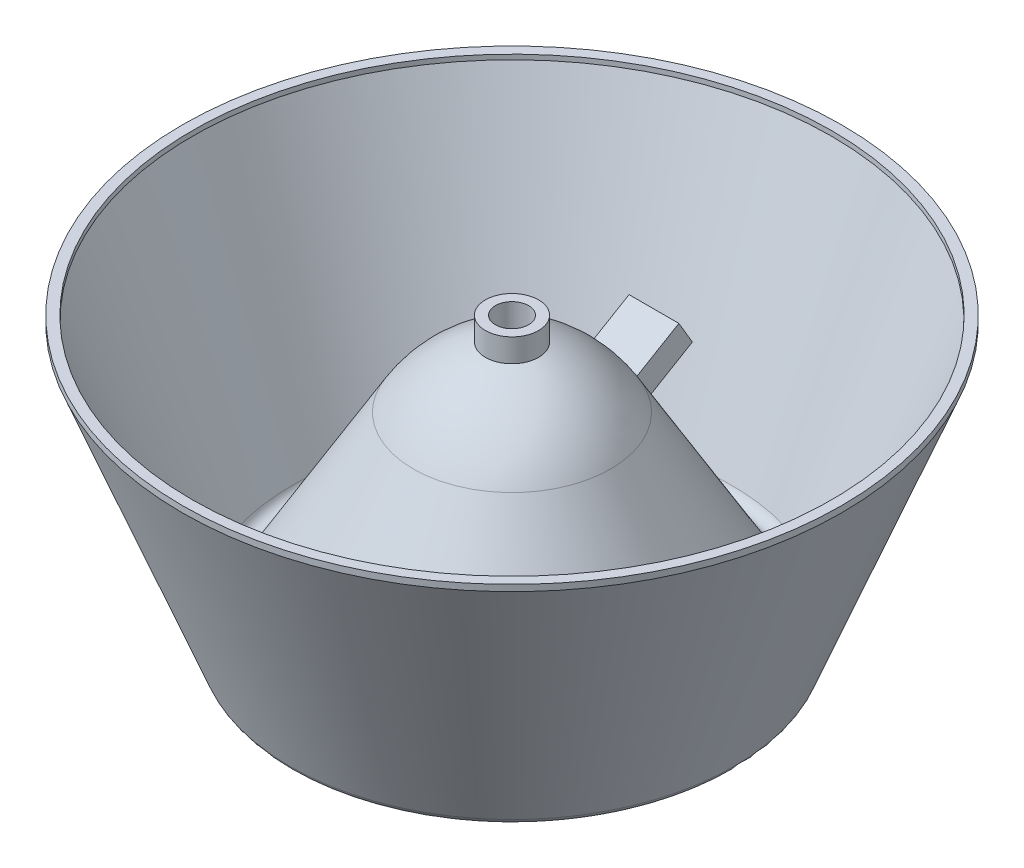
ISO-10303-21;
HEADER;
FILE_DESCRIPTION(('STEP AP214'),'2;1');
FILE_NAME('part.step','',(''),(''),'','','');
FILE_SCHEMA(('AUTOMOTIVE_DESIGN { 1 0 10303 214 1 1 1 1 }'));
ENDSEC;
DATA;
#1=APPLICATION_CONTEXT('core data for automotive mechanical design processes');
#2=APPLICATION_PROTOCOL_DEFINITION('international standard','automotive_design',2000,#1);
#3=PRODUCT_CONTEXT('',#1,'mechanical');
#4=PRODUCT('Part','Part','',(#3));
#5=PRODUCT_RELATED_PRODUCT_CATEGORY('part','',(#4));
#6=PRODUCT_DEFINITION_FORMATION('','',#4);
#7=PRODUCT_DEFINITION_CONTEXT('part definition',#1,'design');
#8=PRODUCT_DEFINITION('design','',#6,#7);
#9=PRODUCT_DEFINITION_SHAPE('','',#8);
#10=(LENGTH_UNIT() NAMED_UNIT(*) SI_UNIT(.MILLI.,.METRE.));
#11=(NAMED_UNIT(*) PLANE_ANGLE_UNIT() SI_UNIT($,.RADIAN.));
#12=(NAMED_UNIT(*) SI_UNIT($,.STERADIAN.) SOLID_ANGLE_UNIT());
#13=UNCERTAINTY_MEASURE_WITH_UNIT(LENGTH_MEASURE(1.E-05),#10,'distance_accuracy_value','');
#14=(GEOMETRIC_REPRESENTATION_CONTEXT(3) GLOBAL_UNCERTAINTY_ASSIGNED_CONTEXT((#13)) GLOBAL_UNIT_ASSIGNED_CONTEXT((#10,
#11,#12)) REPRESENTATION_CONTEXT('',''));
#15=CARTESIAN_POINT('',(0.,0.,0.));
#16=DIRECTION('',(0.,0.,1.));
#17=DIRECTION('',(1.,0.,0.));
#18=AXIS2_PLACEMENT_3D('',#15,#16,#17);
#19=CARTESIAN_POINT('',(-7.5,17.6177553116184,-29.8163640733624));
#20=DIRECTION('',(-1.,0.,0.));
#21=DIRECTION('',(0.,-1.,0.));
#22=AXIS2_PLACEMENT_3D('',#19,#20,#21);
#23=PLANE('',#22);
#24=DIRECTION('',(0.,-0.508707797241376,0.860939241192912));
#25=VECTOR('',#24,1.);
#26=CARTESIAN_POINT('',(-7.5,18.3608583406957,-46.8001150691871));
#27=LINE('',#26,#25);
#28=CARTESIAN_POINT('',(-7.5,10.8824342590664,-34.1435983240707));
#29=VERTEX_POINT('',#28);
#30=CARTESIAN_POINT('',(-7.5,10.7302413820751,-33.8860264512935));
#31=VERTEX_POINT('',#30);
#32=EDGE_CURVE('E229',#29,#31,#27,.T.);
#33=ORIENTED_EDGE('',*,*,#32,.T.);
#34=DIRECTION('',(0.,0.860939241192912,0.508707797241376));
#35=VECTOR('',#34,1.);
#36=CARTESIAN_POINT('',(-7.5,17.6177553116184,-29.8163640733624));
#37=LINE('',#36,#35);
#38=CARTESIAN_POINT('',(-7.50000000000001,-25.4292067480272,-55.2517539354313));
#39=VERTEX_POINT('',#38);
#40=EDGE_CURVE('E127',#39,#31,#37,.T.);
#41=ORIENTED_EDGE('',*,*,#40,.F.);
#42=DIRECTION('',(0.,0.508707797241376,-0.860939241192912));
#43=VECTOR('',#42,1.);
#44=CARTESIAN_POINT('',(-7.50000000000001,-25.4292067480272,-55.2517539354313));
#45=LINE('',#44,#43);
#46=CARTESIAN_POINT('',(-7.50000000000001,-25.1404930881364,-55.7403741622419));
#47=VERTEX_POINT('',#46);
#48=EDGE_CURVE('E214',#39,#47,#45,.T.);
#49=ORIENTED_EDGE('',*,*,#48,.T.);
#50=CARTESIAN_POINT('',(-7.50000000000001,-78.2959236565766,-87.3294526501962));
#51=CARTESIAN_POINT('',(-7.50000000000001,-75.8072424658091,-85.8535365891244));
#52=CARTESIAN_POINT('',(-7.50000000000001,-73.3186790037428,-84.37742199946));
#53=CARTESIAN_POINT('',(-7.50000000000001,-68.3418339324585,-81.4247178840379));
#54=CARTESIAN_POINT('',(-7.50000000000001,-65.8535523232342,-79.9481283582909));
#55=CARTESIAN_POINT('',(-7.50000000000001,-58.3892411627185,-75.5175550698542));
#56=CARTESIAN_POINT('',(-7.50000000000001,-53.4137038054839,-72.5627420037978));
#57=CARTESIAN_POINT('',(-7.50000000000001,-43.4646653719267,-66.6500855613413));
#58=CARTESIAN_POINT('',(-7.50000000000001,-38.4911642303533,-63.6922422947675));
#59=CARTESIAN_POINT('',(-7.50000000000001,-31.0330070261629,-59.2519135426881));
#60=CARTESIAN_POINT('',(-7.50000000000001,-28.5472936741958,-57.7712039956883));
#61=CARTESIAN_POINT('',(-7.50000000000001,-23.5767590277901,-54.8082853943409));
#62=CARTESIAN_POINT('',(-7.50000000000001,-21.0919377337984,-53.3260763392435));
#63=CARTESIAN_POINT('',(-7.50000000000001,-16.1232731068763,-50.3596521998415));
#64=CARTESIAN_POINT('',(-7.5,-13.6394298482085,-48.8754369911332));
#65=CARTESIAN_POINT('',(-7.5,-8.67323770306839,-45.9045176878603));
#66=CARTESIAN_POINT('',(-7.5,-6.19088881402328,-44.4178135975975));
#67=CARTESIAN_POINT('',(-7.5,-1.22824721221866,-41.4410984617895));
#68=CARTESIAN_POINT('',(-7.5,1.25204554385469,-39.9510874884695));
#69=CARTESIAN_POINT('',(-7.5,6.20987909939063,-36.9664553675609));
#70=CARTESIAN_POINT('',(-7.5,8.68741988141323,-35.4718341909804));
#71=CARTESIAN_POINT('',(-7.5,12.4007996317308,-33.2248476815478));
#72=CARTESIAN_POINT('',(-7.5,13.6381507318612,-32.4749814606753));
#73=CARTESIAN_POINT('',(-7.5,16.1116044056383,-30.9731943424338));
#74=CARTESIAN_POINT('',(-7.5,17.3477069803027,-30.2212734467414));
#75=CARTESIAN_POINT('',(-7.5,19.8183377863805,-28.7148989643022));
#76=CARTESIAN_POINT('',(-7.5,21.0528660458354,-27.9604454235612));
#77=CARTESIAN_POINT('',(-7.5,23.5199568127787,-26.4483206834647));
#78=CARTESIAN_POINT('',(-7.5,24.7525193140722,-25.6906494739964));
#79=CARTESIAN_POINT('',(-7.5,27.2151914927506,-24.17109966192));
#80=CARTESIAN_POINT('',(-7.5,28.4453009565273,-23.4092207129646));
#81=CARTESIAN_POINT('',(-7.5,30.9021159161678,-21.8800098689824));
#82=CARTESIAN_POINT('',(-7.5,32.128821441805,-21.112678021861));
#83=CARTESIAN_POINT('',(-7.5,33.9653999061876,-19.9560674656488));
#84=CARTESIAN_POINT('',(-7.5,34.5770323110517,-19.5695826680385));
#85=CARTESIAN_POINT('',(-7.5,35.7988885586431,-18.7943954420286));
#86=CARTESIAN_POINT('',(-7.5,36.4091124050098,-18.4056930193679));
#87=CARTESIAN_POINT('',(-7.5,37.6278922824839,-17.6256404719913));
#88=CARTESIAN_POINT('',(-7.5,38.2364482642385,-17.23429027009));
#89=CARTESIAN_POINT('',(-7.5,39.4514797299034,-16.4483626958194));
#90=CARTESIAN_POINT('',(-7.5,40.0579551951632,-16.0537852946272));
#91=CARTESIAN_POINT('',(-7.5,40.663187584382,-15.6573024185188));
#92=B_SPLINE_CURVE_WITH_KNOTS('',3,(#50,#51,#52,#53,#54,#55,#56,#57,#58,#59,#60,#61,#62,#63,#64,
#65,#66,#67,#68,#69,#70,#71,#72,#73,#74,#75,#76,#77,#78,#79,#80,#81,#82,#83,#84,#85,#86,#87,#88,
#89,#90,#91),.UNSPECIFIED.,.F.,.F.,(4,2,2,2,2,2,2,2,2,2,2,2,2,2,2,2,2,2,2,2,4),(0.,
8.6802511798237,17.3605021649744,34.7208594869677,52.0806084146688,60.7605529932917,
69.4405019153928,78.1210163470184,86.8015157906846,95.4818274745224,104.162193857519,
108.50270312475,112.843208851234,117.183636153988,121.524077108409,125.864880822158,
130.20564644765,132.376168445392,134.546684828708,136.717264759773,138.887864098095),.UNSPECIFIED.);
#93=EDGE_CURVE('E11',#47,#29,#92,.T.);
#94=ORIENTED_EDGE('',*,*,#93,.T.);
#95=EDGE_LOOP('',(#33,#41,#49,#94));
#96=FACE_BOUND('',#95,.T.);
#97=ADVANCED_FACE('F35',(#96),#23,.F.);
#98=CARTESIAN_POINT('',(7.5,17.6177553116184,-29.8163640733624));
#99=DIRECTION('',(1.,0.,0.));
#100=DIRECTION('',(0.,0.,-1.));
#101=AXIS2_PLACEMENT_3D('',#98,#99,#100);
#102=PLANE('',#101);
#103=DIRECTION('',(0.,-0.508707797241376,0.860939241192912));
#104=VECTOR('',#103,1.);
#105=CARTESIAN_POINT('',(7.5,18.3608583406957,-46.8001150691871));
#106=LINE('',#105,#104);
#107=CARTESIAN_POINT('',(7.5,10.8824342590664,-34.1435983240707));
#108=VERTEX_POINT('',#107);
#109=CARTESIAN_POINT('',(7.5,10.7302413820751,-33.8860264512935));
#110=VERTEX_POINT('',#109);
#111=EDGE_CURVE('E56',#108,#110,#106,.T.);
#112=ORIENTED_EDGE('',*,*,#111,.F.);
#113=CARTESIAN_POINT('',(7.5,40.663187584382,-15.6573024185188));
#114=CARTESIAN_POINT('',(7.5,40.2620034828616,-15.9201365812154));
#115=CARTESIAN_POINT('',(7.5,39.8602619789159,-16.1821177418864));
#116=CARTESIAN_POINT('',(7.5,39.0557989241939,-16.7045680863922));
#117=CARTESIAN_POINT('',(7.5,38.6530773769659,-16.9650372756895));
#118=CARTESIAN_POINT('',(7.5,37.4436529544709,-17.7444627056552));
#119=CARTESIAN_POINT('',(7.5,36.6356778447362,-18.2614449498447));
#120=CARTESIAN_POINT('',(7.5,35.0171438524521,-19.2912643009652));
#121=CARTESIAN_POINT('',(7.5,34.2065850854791,-19.8041015897849));
#122=CARTESIAN_POINT('',(7.5,32.5833880193871,-20.8264810376036));
#123=CARTESIAN_POINT('',(7.5,31.7707497108971,-21.3360231817171));
#124=CARTESIAN_POINT('',(7.5,30.1438658487967,-22.3523897791579));
#125=CARTESIAN_POINT('',(7.5,29.3296204277745,-22.8592144448293));
#126=CARTESIAN_POINT('',(7.5,27.6997587472283,-23.870655312069));
#127=CARTESIAN_POINT('',(7.5,26.8841424865896,-24.3752715118401));
#128=CARTESIAN_POINT('',(7.5,24.4355800955489,-25.8863903811134));
#129=CARTESIAN_POINT('',(7.5,22.8009413349899,-26.8901502433462));
#130=CARTESIAN_POINT('',(7.5,19.5146481061385,-28.9009055550387));
#131=CARTESIAN_POINT('',(7.5,17.8629665574604,-29.9078566935923));
#132=CARTESIAN_POINT('',(7.5,14.5572047123887,-31.9178151356367));
#133=CARTESIAN_POINT('',(7.5,12.9031244142159,-32.9208224362001));
#134=CARTESIAN_POINT('',(7.5,9.59315447528326,-34.9238319243822));
#135=CARTESIAN_POINT('',(7.5,7.93726484131064,-35.9238341232212));
#136=CARTESIAN_POINT('',(7.5,4.62407148659936,-37.9214936538684));
#137=CARTESIAN_POINT('',(7.5,2.9667677654635,-38.9191509850177));
#138=CARTESIAN_POINT('',(7.5,-2.00705470353317,-41.9095063925066));
#139=CARTESIAN_POINT('',(7.5,-5.32523657706097,-43.8994379197964));
#140=CARTESIAN_POINT('',(7.5,-11.964502255354,-47.8744514582729));
#141=CARTESIAN_POINT('',(7.5,-15.285586060384,-49.859533469017));
#142=CARTESIAN_POINT('',(7.5,-21.0921502702951,-53.3262012982111));
#143=CARTESIAN_POINT('',(7.5,-23.5771827055915,-54.8085375933506));
#144=CARTESIAN_POINT('',(7.5,-28.5481418956195,-57.7717099720899));
#145=CARTESIAN_POINT('',(7.5,-31.0340686503877,-59.2525460556282));
#146=CARTESIAN_POINT('',(7.5,-38.4929066251018,-63.6932787307508));
#147=CARTESIAN_POINT('',(7.5,-43.4668750811611,-66.6513994638513));
#148=CARTESIAN_POINT('',(7.5,-53.4159575046666,-72.5640806853375));
#149=CARTESIAN_POINT('',(7.5,-58.3910712038658,-75.5186416252194));
#150=CARTESIAN_POINT('',(7.5,-65.8547243100279,-79.9488238610734));
#151=CARTESIAN_POINT('',(7.5,-68.3427716371233,-81.4252742689533));
#152=CARTESIAN_POINT('',(7.5,-73.3191479572686,-84.3777001686748));
#153=CARTESIAN_POINT('',(7.5,-75.8074769503101,-85.8536756605304));
#154=CARTESIAN_POINT('',(7.5,-78.2959236565766,-87.3294526501962));
#155=B_SPLINE_CURVE_WITH_KNOTS('',3,(#113,#114,#115,#116,#117,#118,#119,#120,#121,#122,#123,
#124,#125,#126,#127,#128,#129,#130,#131,#132,#133,#134,#135,#136,#137,#138,#139,#140,#141,#142,
#143,#144,#145,#146,#147,#148,#149,#150,#151,#152,#153,#154),.UNSPECIFIED.,.F.,.F.,(4,2,2,2,2,2,
2,2,2,2,2,2,2,2,2,2,2,2,2,2,4),(0.,1.43884185034581,2.87767849910715,5.7553071614059,
8.63280885457372,11.5103235375057,14.3876099948145,17.2648987930749,23.0195505520148,
28.8228210080389,34.626095770658,40.4293488382883,46.2326035365261,57.8399828386359,
69.4473632000664,78.128051703274,86.8087405623367,104.170119937378,121.528998243479,
130.208431807839,138.887865115401),.UNSPECIFIED.);
#156=CARTESIAN_POINT('',(7.5,-25.1404930881364,-55.7403741622419));
#157=VERTEX_POINT('',#156);
#158=EDGE_CURVE('E169',#108,#157,#155,.T.);
#159=ORIENTED_EDGE('',*,*,#158,.T.);
#160=DIRECTION('',(0.,0.508707797241376,-0.860939241192912));
#161=VECTOR('',#160,1.);
#162=CARTESIAN_POINT('',(7.5,-25.4292067480272,-55.2517539354313));
#163=LINE('',#162,#161);
#164=CARTESIAN_POINT('',(7.5,-25.4292067480272,-55.2517539354313));
#165=VERTEX_POINT('',#164);
#166=EDGE_CURVE('E215',#165,#157,#163,.T.);
#167=ORIENTED_EDGE('',*,*,#166,.F.);
#168=DIRECTION('',(0.,-0.860939241192912,-0.508707797241376));
#169=VECTOR('',#168,1.);
#170=CARTESIAN_POINT('',(7.5,17.6177553116184,-29.8163640733624));
#171=LINE('',#170,#169);
#172=EDGE_CURVE('E220',#110,#165,#171,.T.);
#173=ORIENTED_EDGE('',*,*,#172,.F.);
#174=EDGE_LOOP('',(#112,#159,#167,#173));
#175=FACE_BOUND('',#174,.T.);
#176=ADVANCED_FACE('F152',(#175),#102,.F.);
#177=CARTESIAN_POINT('',(0.,17.6177553116184,-29.8163640733624));
#178=DIRECTION('',(0.,0.508707797241376,-0.860939241192912));
#179=DIRECTION('',(0.,0.860939241192912,0.508707797241376));
#180=AXIS2_PLACEMENT_3D('',#177,#178,#179);
#181=PLANE('',#180);
#182=ORIENTED_EDGE('',*,*,#40,.T.);
#183=DIRECTION('',(-1.,0.,0.));
#184=VECTOR('',#183,1.);
#185=CARTESIAN_POINT('',(-7.5,10.7302413820751,-33.8860264512935));
#186=LINE('',#185,#184);
#187=EDGE_CURVE('E121',#110,#31,#186,.T.);
#188=ORIENTED_EDGE('',*,*,#187,.F.);
#189=ORIENTED_EDGE('',*,*,#172,.T.);
#190=DIRECTION('',(-1.,0.,0.));
#191=VECTOR('',#190,1.);
#192=CARTESIAN_POINT('',(7.5,-25.4292067480272,-55.2517539354313));
#193=LINE('',#192,#191);
#194=EDGE_CURVE('E217',#165,#39,#193,.T.);
#195=ORIENTED_EDGE('',*,*,#194,.T.);
#196=EDGE_LOOP('',(#182,#188,#189,#195));
#197=FACE_BOUND('',#196,.T.);
#198=ADVANCED_FACE('F149',(#197),#181,.T.);
#199=CARTESIAN_POINT('',(0.,-1.95690324686581,0.));
#200=DIRECTION('',(0.,1.,0.));
#201=DIRECTION('',(0.,0.,1.));
#202=AXIS2_PLACEMENT_3D('',#199,#200,#201);
#203=DEGENERATE_TOROIDAL_SURFACE('',#202,7.03530969226617,39.6848334855076,.F.);
#204=CARTESIAN_POINT('',(0.,35.858931126895,0.));
#205=DIRECTION('',(0.,1.,0.));
#206=DIRECTION('',(0.,0.,1.));
#207=AXIS2_PLACEMENT_3D('',#204,#205,#206);
#208=CIRCLE('',#207,5.00000000000001);
#209=CARTESIAN_POINT('',(0.,35.858931126895,5.));
#210=VERTEX_POINT('',#209);
#211=EDGE_CURVE('E211',#210,#210,#208,.T.);
#212=ORIENTED_EDGE('',*,*,#211,.T.);
#213=EDGE_LOOP('',(#212));
#214=FACE_BOUND('',#213,.T.);
#215=CARTESIAN_POINT('',(0.,18.2310809794375,0.));
#216=DIRECTION('',(0.,1.,0.));
#217=DIRECTION('',(0.,0.,1.));
#218=AXIS2_PLACEMENT_3D('',#215,#216,#217);
#219=CIRCLE('',#218,27.1309207356138);
#220=CARTESIAN_POINT('',(0.,18.2310809794375,27.1309207356138));
#221=VERTEX_POINT('',#220);
#222=EDGE_CURVE('E172',#221,#221,#219,.T.);
#223=ORIENTED_EDGE('',*,*,#222,.F.);
#224=EDGE_LOOP('',(#223));
#225=FACE_BOUND('',#224,.T.);
#226=ADVANCED_FACE('F37',(#214,#225),#203,.T.);
#227=CARTESIAN_POINT('',(0.,-39.7171221385411,0.));
#228=DIRECTION('',(0.,-1.,0.));
#229=DIRECTION('',(0.,0.,-1.));
#230=AXIS2_PLACEMENT_3D('',#227,#228,#229);
#231=CONICAL_SURFACE('',#230,61.3710870003054,0.533683201438926);
#232=ORIENTED_EDGE('',*,*,#222,.T.);
#233=EDGE_LOOP('',(#232));
#234=FACE_BOUND('',#233,.T.);
#235=CARTESIAN_POINT('',(0.,-39.7171221385411,0.));
#236=DIRECTION('',(0.,1.,0.));
#237=DIRECTION('',(0.,0.,1.));
#238=AXIS2_PLACEMENT_3D('',#235,#236,#237);
#239=CIRCLE('',#238,61.3710870003054);
#240=CARTESIAN_POINT('',(0.,-39.7171221385411,61.3710870003054));
#241=VERTEX_POINT('',#240);
#242=EDGE_CURVE('E175',#241,#241,#239,.T.);
#243=ORIENTED_EDGE('',*,*,#242,.F.);
#244=EDGE_LOOP('',(#243));
#245=FACE_BOUND('',#244,.T.);
#246=ADVANCED_FACE('F268',(#234,#245),#231,.F.);
#247=CARTESIAN_POINT('',(0.,-38.1909987468171,0.));
#248=DIRECTION('',(0.,1.,0.));
#249=DIRECTION('',(0.,0.,1.));
#250=AXIS2_PLACEMENT_3D('',#247,#248,#249);
#251=TOROIDAL_SURFACE('',#250,63.9539047238842,3.);
#252=ORIENTED_EDGE('',*,*,#242,.T.);
#253=EDGE_LOOP('',(#252));
#254=FACE_BOUND('',#253,.T.);
#255=CARTESIAN_POINT('',(0.,-39.2919906208832,0.));
#256=DIRECTION('',(0.,1.,0.));
#257=DIRECTION('',(0.,0.,1.));
#258=AXIS2_PLACEMENT_3D('',#255,#256,#257);
#259=CIRCLE('',#258,66.7445707542863);
#260=CARTESIAN_POINT('',(0.,-39.2919906208832,66.7445707542863));
#261=VERTEX_POINT('',#260);
#262=EDGE_CURVE('E178',#261,#261,#259,.T.);
#263=ORIENTED_EDGE('',*,*,#262,.F.);
#264=EDGE_LOOP('',(#263));
#265=FACE_BOUND('',#264,.T.);
#266=ADVANCED_FACE('F275',(#254,#265),#251,.T.);
#267=CARTESIAN_POINT('',(0.,43.102019875595,0.));
#268=DIRECTION('',(0.,1.,0.));
#269=DIRECTION('',(0.,0.,1.));
#270=AXIS2_PLACEMENT_3D('',#267,#268,#269);
#271=CONICAL_SURFACE('',#270,99.2511964271812,0.375779008642854);
#272=ORIENTED_EDGE('',*,*,#262,.T.);
#273=EDGE_LOOP('',(#272));
#274=FACE_BOUND('',#273,.T.);
#275=CARTESIAN_POINT('',(0.,43.102019875595,0.));
#276=DIRECTION('',(0.,1.,0.));
#277=DIRECTION('',(0.,0.,1.));
#278=AXIS2_PLACEMENT_3D('',#275,#276,#277);
#279=CIRCLE('',#278,99.2511964271812);
#280=CARTESIAN_POINT('',(0.,43.102019875595,99.2511964271812));
#281=VERTEX_POINT('',#280);
#282=EDGE_CURVE('E181',#281,#281,#279,.T.);
#283=ORIENTED_EDGE('',*,*,#282,.F.);
#284=EDGE_LOOP('',(#283));
#285=FACE_BOUND('',#284,.T.);
#286=ADVANCED_FACE('F282',(#274,#285),#271,.T.);
#287=CARTESIAN_POINT('',(0.,0.,0.));
#288=DIRECTION('',(0.,1.,0.));
#289=DIRECTION('',(0.,0.,1.));
#290=AXIS2_PLACEMENT_3D('',#287,#288,#289);
#291=CYLINDRICAL_SURFACE('',#290,99.2511964271812);
#292=ORIENTED_EDGE('',*,*,#282,.T.);
#293=EDGE_LOOP('',(#292));
#294=FACE_BOUND('',#293,.T.);
#295=CARTESIAN_POINT('',(0.,45.,0.));
#296=DIRECTION('',(0.,1.,0.));
#297=DIRECTION('',(0.,0.,1.));
#298=AXIS2_PLACEMENT_3D('',#295,#296,#297);
#299=CIRCLE('',#298,99.2511964271812);
#300=CARTESIAN_POINT('',(0.,45.,99.2511964271812));
#301=VERTEX_POINT('',#300);
#302=EDGE_CURVE('E184',#301,#301,#299,.T.);
#303=ORIENTED_EDGE('',*,*,#302,.F.);
#304=EDGE_LOOP('',(#303));
#305=FACE_BOUND('',#304,.T.);
#306=ADVANCED_FACE('F290',(#294,#305),#291,.T.);
#307=CARTESIAN_POINT('',(0.,45.,99.2511964271812));
#308=DIRECTION('',(0.,1.,0.));
#309=DIRECTION('',(0.,0.,1.));
#310=AXIS2_PLACEMENT_3D('',#307,#308,#309);
#311=PLANE('',#310);
#312=ORIENTED_EDGE('',*,*,#302,.T.);
#313=EDGE_LOOP('',(#312));
#314=FACE_BOUND('',#313,.T.);
#315=CARTESIAN_POINT('',(0.,45.,0.));
#316=DIRECTION('',(0.,1.,0.));
#317=DIRECTION('',(0.,0.,1.));
#318=AXIS2_PLACEMENT_3D('',#315,#316,#317);
#319=CIRCLE('',#318,96.2511964271812);
#320=CARTESIAN_POINT('',(0.,45.,96.2511964271812));
#321=VERTEX_POINT('',#320);
#322=EDGE_CURVE('E187',#321,#321,#319,.T.);
#323=ORIENTED_EDGE('',*,*,#322,.F.);
#324=EDGE_LOOP('',(#323));
#325=FACE_BOUND('',#324,.T.);
#326=ADVANCED_FACE('F298',(#314,#325),#311,.T.);
#327=CARTESIAN_POINT('',(0.,43.5587034807107,0.));
#328=DIRECTION('',(0.,1.,0.));
#329=DIRECTION('',(0.,0.,1.));
#330=AXIS2_PLACEMENT_3D('',#327,#328,#329);
#331=CONICAL_SURFACE('',#330,96.2063336707001,0.0311166200573972);
#332=ORIENTED_EDGE('',*,*,#322,.T.);
#333=EDGE_LOOP('',(#332));
#334=FACE_BOUND('',#333,.T.);
#335=CARTESIAN_POINT('',(0.,43.5587034807107,0.));
#336=DIRECTION('',(0.,1.,0.));
#337=DIRECTION('',(0.,0.,1.));
#338=AXIS2_PLACEMENT_3D('',#335,#336,#337);
#339=CIRCLE('',#338,96.2063336707001);
#340=CARTESIAN_POINT('',(0.,43.5587034807108,96.2063336707001));
#341=VERTEX_POINT('',#340);
#342=EDGE_CURVE('E190',#341,#341,#339,.T.);
#343=ORIENTED_EDGE('',*,*,#342,.F.);
#344=EDGE_LOOP('',(#343));
#345=FACE_BOUND('',#344,.T.);
#346=ADVANCED_FACE('F306',(#334,#345),#331,.F.);
#347=CARTESIAN_POINT('',(0.,-32.4829893677001,0.));
#348=DIRECTION('',(0.,1.,0.));
#349=DIRECTION('',(0.,0.,1.));
#350=AXIS2_PLACEMENT_3D('',#347,#348,#349);
#351=CONICAL_SURFACE('',#350,66.2058660388666,0.375779008642855);
#352=ORIENTED_EDGE('',*,*,#342,.T.);
#353=EDGE_LOOP('',(#352));
#354=FACE_BOUND('',#353,.T.);
#355=CARTESIAN_POINT('',(0.,-32.4829893677001,0.));
#356=DIRECTION('',(0.,1.,0.));
#357=DIRECTION('',(0.,0.,1.));
#358=AXIS2_PLACEMENT_3D('',#355,#356,#357);
#359=CIRCLE('',#358,66.2058660388666);
#360=CARTESIAN_POINT('',(0.,-32.4829893677001,66.2058660388666));
#361=VERTEX_POINT('',#360);
#362=EDGE_CURVE('E193',#361,#361,#359,.T.);
#363=ORIENTED_EDGE('',*,*,#362,.F.);
#364=EDGE_LOOP('',(#363));
#365=FACE_BOUND('',#364,.T.);
#366=ADVANCED_FACE('F314',(#354,#365),#351,.F.);
#367=CARTESIAN_POINT('',(0.,-31.381997493634,0.));
#368=DIRECTION('',(0.,1.,0.));
#369=DIRECTION('',(0.,0.,1.));
#370=AXIS2_PLACEMENT_3D('',#367,#368,#369);
#371=TOROIDAL_SURFACE('',#370,63.4152000084645,3.);
#372=ORIENTED_EDGE('',*,*,#362,.T.);
#373=EDGE_LOOP('',(#372));
#374=FACE_BOUND('',#373,.T.);
#375=CARTESIAN_POINT('',(0.,-32.9081208853581,0.));
#376=DIRECTION('',(0.,1.,0.));
#377=DIRECTION('',(0.,0.,1.));
#378=AXIS2_PLACEMENT_3D('',#375,#376,#377);
#379=CIRCLE('',#378,60.8323822848857);
#380=CARTESIAN_POINT('',(0.,-32.9081208853581,60.8323822848857));
#381=VERTEX_POINT('',#380);
#382=EDGE_CURVE('E196',#381,#381,#379,.T.);
#383=ORIENTED_EDGE('',*,*,#382,.F.);
#384=EDGE_LOOP('',(#383));
#385=FACE_BOUND('',#384,.T.);
#386=ADVANCED_FACE('F322',(#374,#385),#371,.F.);
#387=CARTESIAN_POINT('',(0.,19.7572043711617,0.));
#388=DIRECTION('',(0.,-1.,0.));
#389=DIRECTION('',(0.,0.,-1.));
#390=AXIS2_PLACEMENT_3D('',#387,#388,#389);
#391=CONICAL_SURFACE('',#390,29.7137384591925,0.533683201438927);
#392=CARTESIAN_POINT('',(0.,-9.72328631425427,16.4557311421029));
#393=DIRECTION('',(0.,0.860939241192912,0.508707797241376));
#394=DIRECTION('',(0.,-0.508707797241376,0.860939241192912));
#395=AXIS2_PLACEMENT_3D('',#392,#393,#394);
#396=ELLIPSE('',#395,54.7460636029913,44.1670901200357);
#397=CARTESIAN_POINT('',(-7.5,17.7219976759478,-29.9927842944257));
#398=VERTEX_POINT('',#397);
#399=CARTESIAN_POINT('',(7.5,17.7219976759478,-29.9927842944256));
#400=VERTEX_POINT('',#399);
#401=EDGE_CURVE('E170',#398,#400,#396,.F.);
#402=ORIENTED_EDGE('',*,*,#401,.F.);
#403=CARTESIAN_POINT('',(-7.5,43.7672386851387,-13.5952760686229));
#404=CARTESIAN_POINT('',(-7.5,43.4115947294104,-13.8352624940551));
#405=CARTESIAN_POINT('',(-7.5,43.0552749632871,-14.0742439681568));
#406=CARTESIAN_POINT('',(-7.5,42.3414530963691,-14.5504300104518));
#407=CARTESIAN_POINT('',(-7.5,41.9839510031884,-14.7876345900559));
#408=CARTESIAN_POINT('',(-7.5,40.9099377292122,-15.4969242435676));
#409=CARTESIAN_POINT('',(-7.5,40.1919002222485,-15.9666982393986));
#410=CARTESIAN_POINT('',(-7.5,38.7527635347994,-16.9014109706817));
#411=CARTESIAN_POINT('',(-7.5,38.0316645773803,-17.3663500501853));
#412=CARTESIAN_POINT('',(-7.5,36.5870112690397,-18.2924078348262));
#413=CARTESIAN_POINT('',(-7.5,35.8634568987799,-18.7535265097759));
#414=CARTESIAN_POINT('',(-7.5,34.4144797991638,-19.6726094901062));
#415=CARTESIAN_POINT('',(-7.5,33.6890573228234,-20.1305741946632));
#416=CARTESIAN_POINT('',(-7.5,32.2366167323456,-21.0439606686029));
#417=CARTESIAN_POINT('',(-7.5,31.509598622559,-21.4993824449075));
#418=CARTESIAN_POINT('',(-7.5,30.0542280963463,-22.4081219852347));
#419=CARTESIAN_POINT('',(-7.5,29.3258756524561,-22.861439705256));
#420=CARTESIAN_POINT('',(-7.5,27.8680666160572,-23.7662966478443));
#421=CARTESIAN_POINT('',(-7.5,27.1386100228526,-24.2178358692898));
#422=CARTESIAN_POINT('',(-7.5,25.1720480268993,-25.4323505206621));
#423=CARTESIAN_POINT('',(-7.5,23.9340734754555,-26.193918576162));
#424=CARTESIAN_POINT('',(-7.5,21.4560923340588,-27.713718033182));
#425=CARTESIAN_POINT('',(-7.5,20.2160857595521,-28.4719494599052));
#426=CARTESIAN_POINT('',(-7.5,17.7343996857449,-29.9858205704829));
#427=CARTESIAN_POINT('',(-7.5,16.4927200993408,-30.7414601115092));
#428=CARTESIAN_POINT('',(-7.5,14.0080735461003,-32.2506253222303));
#429=CARTESIAN_POINT('',(-7.5,12.7651065763826,-33.00415098718));
#430=CARTESIAN_POINT('',(-7.5,10.1660615555142,-34.5773101814787));
#431=CARTESIAN_POINT('',(-7.5,8.80988520087585,-35.3967812749504));
#432=CARTESIAN_POINT('',(-7.5,6.09652579722206,-37.0340553235997));
#433=CARTESIAN_POINT('',(-7.5,4.73934274801376,-37.8518582784576));
#434=CARTESIAN_POINT('',(-7.5,0.666561414055446,-40.303220693099));
#435=CARTESIAN_POINT('',(-7.5,-2.0502686938475,-41.93473348336));
#436=CARTESIAN_POINT('',(-7.5,-7.48584317379729,-45.1937193878916));
#437=CARTESIAN_POINT('',(-7.5,-10.2045872323473,-46.8211930253143));
#438=CARTESIAN_POINT('',(-7.5,-14.2839561476105,-49.2603005238834));
#439=CARTESIAN_POINT('',(-7.5,-15.6439530292259,-50.0729849324257));
#440=CARTESIAN_POINT('',(-7.5,-18.3643116268448,-51.6977424909647));
#441=CARTESIAN_POINT('',(-7.50000000000001,-19.724673342798,-52.5098156410457));
#442=CARTESIAN_POINT('',(-7.50000000000001,-21.085190756648,-53.321627824835));
#443=B_SPLINE_CURVE_WITH_KNOTS('',3,(#403,#404,#405,#406,#407,#408,#409,#410,#411,#412,#413,
#414,#415,#416,#417,#418,#419,#420,#421,#422,#423,#424,#425,#426,#427,#428,#429,#430,#431,#432,
#433,#434,#435,#436,#437,#438,#439,#440,#441,#442),.UNSPECIFIED.,.F.,.F.,(4,2,2,2,2,2,2,2,2,2,2,
2,2,2,2,2,2,2,2,4),(0.,1.28711807616795,2.57422787972128,5.14837758861315,7.72234285055366,
10.2963284317401,12.8699820228428,15.4436286051077,18.0173287685821,20.5910305544701,
24.9514245140566,29.3117854809263,33.6723829886287,38.0329902770232,42.7865899894955,
47.5401906129513,57.0473931330763,66.553292271099,71.3062309316859,76.0591689377836),.UNSPECIFIED.);
#444=EDGE_CURVE('E125',#398,#29,#443,.T.);
#445=ORIENTED_EDGE('',*,*,#444,.T.);
#446=ORIENTED_EDGE('',*,*,#93,.F.);
#447=CARTESIAN_POINT('',(0.,-75.8612360945101,30.0996271773252));
#448=DIRECTION('',(0.,-0.860939241192912,-0.508707797241376));
#449=DIRECTION('',(0.,-0.508707797241376,0.860939241192912));
#450=AXIS2_PLACEMENT_3D('',#447,#448,#449);
#451=ELLIPSE('',#450,100.137519849245,80.787230578836);
#452=EDGE_CURVE('E49',#157,#47,#451,.F.);
#453=ORIENTED_EDGE('',*,*,#452,.F.);
#454=ORIENTED_EDGE('',*,*,#158,.F.);
#455=EDGE_CURVE('E163',#400,#108,#155,.T.);
#456=ORIENTED_EDGE('',*,*,#455,.F.);
#457=EDGE_LOOP('',(#402,#445,#446,#453,#454,#456));
#458=FACE_BOUND('',#457,.T.);
#459=ORIENTED_EDGE('',*,*,#382,.T.);
#460=EDGE_LOOP('',(#459));
#461=FACE_BOUND('',#460,.T.);
#462=CARTESIAN_POINT('',(0.,19.7572043711617,0.));
#463=DIRECTION('',(0.,1.,0.));
#464=DIRECTION('',(0.,0.,1.));
#465=AXIS2_PLACEMENT_3D('',#462,#463,#464);
#466=CIRCLE('',#465,29.7137384591925);
#467=CARTESIAN_POINT('',(0.,19.7572043711617,29.7137384591925));
#468=VERTEX_POINT('',#467);
#469=EDGE_CURVE('E199',#468,#468,#466,.T.);
#470=ORIENTED_EDGE('',*,*,#469,.F.);
#471=EDGE_LOOP('',(#470));
#472=FACE_BOUND('',#471,.T.);
#473=ADVANCED_FACE('F139',(#458,#461,#472),#391,.T.);
#474=CARTESIAN_POINT('',(0.,-1.95690324686581,0.));
#475=DIRECTION('',(0.,1.,0.));
#476=DIRECTION('',(0.,0.,1.));
#477=AXIS2_PLACEMENT_3D('',#474,#475,#476);
#478=DEGENERATE_TOROIDAL_SURFACE('',#477,7.03530969226617,42.6848334855075,.F.);
#479=ORIENTED_EDGE('',*,*,#469,.T.);
#480=EDGE_LOOP('',(#479));
#481=FACE_BOUND('',#480,.T.);
#482=CARTESIAN_POINT('',(0.,37.9922453315852,0.));
#483=DIRECTION('',(0.,1.,0.));
#484=DIRECTION('',(0.,0.,1.));
#485=AXIS2_PLACEMENT_3D('',#482,#483,#484);
#486=CIRCLE('',#485,8.00000000000001);
#487=CARTESIAN_POINT('',(0.,37.9922453315852,8.));
#488=VERTEX_POINT('',#487);
#489=EDGE_CURVE('E202',#488,#488,#486,.T.);
#490=ORIENTED_EDGE('',*,*,#489,.F.);
#491=EDGE_LOOP('',(#490));
#492=FACE_BOUND('',#491,.T.);
#493=ADVANCED_FACE('F336',(#481,#492),#478,.F.);
#494=CARTESIAN_POINT('',(0.,0.,0.));
#495=DIRECTION('',(0.,1.,0.));
#496=DIRECTION('',(0.,0.,1.));
#497=AXIS2_PLACEMENT_3D('',#494,#495,#496);
#498=CYLINDRICAL_SURFACE('',#497,8.00000000000001);
#499=ORIENTED_EDGE('',*,*,#489,.T.);
#500=EDGE_LOOP('',(#499));
#501=FACE_BOUND('',#500,.T.);
#502=CARTESIAN_POINT('',(0.,45.,0.));
#503=DIRECTION('',(0.,1.,0.));
#504=DIRECTION('',(0.,0.,1.));
#505=AXIS2_PLACEMENT_3D('',#502,#503,#504);
#506=CIRCLE('',#505,8.00000000000001);
#507=CARTESIAN_POINT('',(0.,45.,8.));
#508=VERTEX_POINT('',#507);
#509=EDGE_CURVE('E205',#508,#508,#506,.T.);
#510=ORIENTED_EDGE('',*,*,#509,.F.);
#511=EDGE_LOOP('',(#510));
#512=FACE_BOUND('',#511,.T.);
#513=ADVANCED_FACE('F342',(#501,#512),#498,.T.);
#514=CARTESIAN_POINT('',(0.,45.,8.));
#515=DIRECTION('',(0.,1.,0.));
#516=DIRECTION('',(0.,0.,1.));
#517=AXIS2_PLACEMENT_3D('',#514,#515,#516);
#518=PLANE('',#517);
#519=ORIENTED_EDGE('',*,*,#509,.T.);
#520=EDGE_LOOP('',(#519));
#521=FACE_BOUND('',#520,.T.);
#522=CARTESIAN_POINT('',(0.,45.,0.));
#523=DIRECTION('',(0.,1.,0.));
#524=DIRECTION('',(0.,0.,1.));
#525=AXIS2_PLACEMENT_3D('',#522,#523,#524);
#526=CIRCLE('',#525,5.00000000000002);
#527=CARTESIAN_POINT('',(0.,45.,5.));
#528=VERTEX_POINT('',#527);
#529=EDGE_CURVE('E208',#528,#528,#526,.T.);
#530=ORIENTED_EDGE('',*,*,#529,.F.);
#531=EDGE_LOOP('',(#530));
#532=FACE_BOUND('',#531,.T.);
#533=ADVANCED_FACE('F349',(#521,#532),#518,.T.);
#534=CARTESIAN_POINT('',(0.,0.,0.));
#535=DIRECTION('',(0.,1.,0.));
#536=DIRECTION('',(0.,0.,1.));
#537=AXIS2_PLACEMENT_3D('',#534,#535,#536);
#538=CYLINDRICAL_SURFACE('',#537,5.00000000000002);
#539=ORIENTED_EDGE('',*,*,#529,.T.);
#540=EDGE_LOOP('',(#539));
#541=FACE_BOUND('',#540,.T.);
#542=ORIENTED_EDGE('',*,*,#211,.F.);
#543=EDGE_LOOP('',(#542));
#544=FACE_BOUND('',#543,.T.);
#545=ADVANCED_FACE('F156',(#541,#544),#538,.F.);
#546=CARTESIAN_POINT('',(7.5,-25.4292067480272,-55.2517539354313));
#547=DIRECTION('',(0.,-0.860939241192912,-0.508707797241376));
#548=DIRECTION('',(0.,0.508707797241376,-0.860939241192912));
#549=AXIS2_PLACEMENT_3D('',#546,#547,#548);
#550=PLANE('',#549);
#551=ORIENTED_EDGE('',*,*,#166,.T.);
#552=ORIENTED_EDGE('',*,*,#452,.T.);
#553=ORIENTED_EDGE('',*,*,#48,.F.);
#554=ORIENTED_EDGE('',*,*,#194,.F.);
#555=EDGE_LOOP('',(#551,#552,#553,#554));
#556=FACE_BOUND('',#555,.T.);
#557=ADVANCED_FACE('F147',(#556),#550,.F.);
#558=CARTESIAN_POINT('',(-7.5,25.248372270239,-42.7304526912561));
#559=DIRECTION('',(1.,0.,0.));
#560=DIRECTION('',(0.,1.,0.));
#561=AXIS2_PLACEMENT_3D('',#558,#559,#560);
#562=PLANE('',#561);
#563=ORIENTED_EDGE('',*,*,#444,.F.);
#564=DIRECTION('',(0.,-0.508707797241376,0.860939241192912));
#565=VECTOR('',#564,1.);
#566=CARTESIAN_POINT('',(-7.5,25.248372270239,-42.7304526912561));
#567=LINE('',#566,#565);
#568=CARTESIAN_POINT('',(-7.5,25.248372270239,-42.7304526912561));
#569=VERTEX_POINT('',#568);
#570=EDGE_CURVE('E105',#569,#398,#567,.T.);
#571=ORIENTED_EDGE('',*,*,#570,.F.);
#572=DIRECTION('',(0.,0.860939241192912,0.508707797241377));
#573=VECTOR('',#572,1.);
#574=CARTESIAN_POINT('',(-7.5,25.248372270239,-42.7304526912561));
#575=LINE('',#574,#573);
#576=CARTESIAN_POINT('',(-7.5,18.3608583406957,-46.8001150691871));
#577=VERTEX_POINT('',#576);
#578=EDGE_CURVE('E112',#577,#569,#575,.T.);
#579=ORIENTED_EDGE('',*,*,#578,.F.);
#580=EDGE_CURVE('E230',#577,#29,#27,.T.);
#581=ORIENTED_EDGE('',*,*,#580,.T.);
#582=EDGE_LOOP('',(#563,#571,#579,#581));
#583=FACE_BOUND('',#582,.T.);
#584=ADVANCED_FACE('F123',(#583),#562,.F.);
#585=CARTESIAN_POINT('',(-7.5,25.248372270239,-42.7304526912561));
#586=DIRECTION('',(0.,-0.860939241192912,-0.508707797241376));
#587=DIRECTION('',(0.,0.508707797241376,-0.860939241192912));
#588=AXIS2_PLACEMENT_3D('',#585,#586,#587);
#589=PLANE('',#588);
#590=ORIENTED_EDGE('',*,*,#401,.T.);
#591=DIRECTION('',(0.,-0.508707797241376,0.860939241192912));
#592=VECTOR('',#591,1.);
#593=CARTESIAN_POINT('',(7.5,25.248372270239,-42.7304526912561));
#594=LINE('',#593,#592);
#595=CARTESIAN_POINT('',(7.5,25.248372270239,-42.7304526912561));
#596=VERTEX_POINT('',#595);
#597=EDGE_CURVE('E108',#596,#400,#594,.T.);
#598=ORIENTED_EDGE('',*,*,#597,.F.);
#599=DIRECTION('',(1.,0.,0.));
#600=VECTOR('',#599,1.);
#601=CARTESIAN_POINT('',(-7.5,25.248372270239,-42.7304526912561));
#602=LINE('',#601,#600);
#603=EDGE_CURVE('E101',#569,#596,#602,.T.);
#604=ORIENTED_EDGE('',*,*,#603,.F.);
#605=ORIENTED_EDGE('',*,*,#570,.T.);
#606=EDGE_LOOP('',(#590,#598,#604,#605));
#607=FACE_BOUND('',#606,.T.);
#608=ADVANCED_FACE('F103',(#607),#589,.F.);
#609=CARTESIAN_POINT('',(7.5,25.248372270239,-42.7304526912561));
#610=DIRECTION('',(-1.,0.,0.));
#611=DIRECTION('',(0.,0.,1.));
#612=AXIS2_PLACEMENT_3D('',#609,#610,#611);
#613=PLANE('',#612);
#614=ORIENTED_EDGE('',*,*,#455,.T.);
#615=CARTESIAN_POINT('',(7.5,18.3608583406957,-46.8001150691871));
#616=VERTEX_POINT('',#615);
#617=EDGE_CURVE('E129',#616,#108,#106,.T.);
#618=ORIENTED_EDGE('',*,*,#617,.F.);
#619=DIRECTION('',(0.,-0.860939241192912,-0.508707797241377));
#620=VECTOR('',#619,1.);
#621=CARTESIAN_POINT('',(7.5,25.248372270239,-42.7304526912561));
#622=LINE('',#621,#620);
#623=EDGE_CURVE('E111',#596,#616,#622,.T.);
#624=ORIENTED_EDGE('',*,*,#623,.F.);
#625=ORIENTED_EDGE('',*,*,#597,.T.);
#626=EDGE_LOOP('',(#614,#618,#624,#625));
#627=FACE_BOUND('',#626,.T.);
#628=ADVANCED_FACE('F241',(#627),#613,.F.);
#629=CARTESIAN_POINT('',(-7.5,18.3608583406957,-46.8001150691871));
#630=DIRECTION('',(0.,0.860939241192912,0.508707797241376));
#631=DIRECTION('',(0.,-0.508707797241376,0.860939241192912));
#632=AXIS2_PLACEMENT_3D('',#629,#630,#631);
#633=PLANE('',#632);
#634=ORIENTED_EDGE('',*,*,#187,.T.);
#635=ORIENTED_EDGE('',*,*,#32,.F.);
#636=ORIENTED_EDGE('',*,*,#580,.F.);
#637=DIRECTION('',(-1.,0.,0.));
#638=VECTOR('',#637,1.);
#639=CARTESIAN_POINT('',(-7.5,18.3608583406957,-46.8001150691871));
#640=LINE('',#639,#638);
#641=EDGE_CURVE('E117',#616,#577,#640,.T.);
#642=ORIENTED_EDGE('',*,*,#641,.F.);
#643=ORIENTED_EDGE('',*,*,#617,.T.);
#644=ORIENTED_EDGE('',*,*,#111,.T.);
#645=EDGE_LOOP('',(#634,#635,#636,#642,#643,#644));
#646=FACE_BOUND('',#645,.T.);
#647=ADVANCED_FACE('F235',(#646),#633,.F.);
#648=CARTESIAN_POINT('',(0.,25.2483722702391,-42.7304526912561));
#649=DIRECTION('',(0.,-0.508707797241377,0.860939241192912));
#650=DIRECTION('',(0.,-0.860939241192912,-0.508707797241377));
#651=AXIS2_PLACEMENT_3D('',#648,#649,#650);
#652=PLANE('',#651);
#653=ORIENTED_EDGE('',*,*,#578,.T.);
#654=ORIENTED_EDGE('',*,*,#603,.T.);
#655=ORIENTED_EDGE('',*,*,#623,.T.);
#656=ORIENTED_EDGE('',*,*,#641,.T.);
#657=EDGE_LOOP('',(#653,#654,#655,#656));
#658=FACE_BOUND('',#657,.T.);
#659=ADVANCED_FACE('F115',(#658),#652,.F.);
#660=CLOSED_SHELL('',(#97,#176,#198,#226,#246,#266,#286,#306,#326,#346,#366,#386,#473,#493,#513,
#533,#545,#557,#584,#608,#628,#647,#659));
#661=MANIFOLD_SOLID_BREP('B2',#660);
#662=ADVANCED_BREP_SHAPE_REPRESENTATION('',(#18,#661),#14);
#663=SHAPE_DEFINITION_REPRESENTATION(#9,#662);
ENDSEC;
END-ISO-10303-21;
